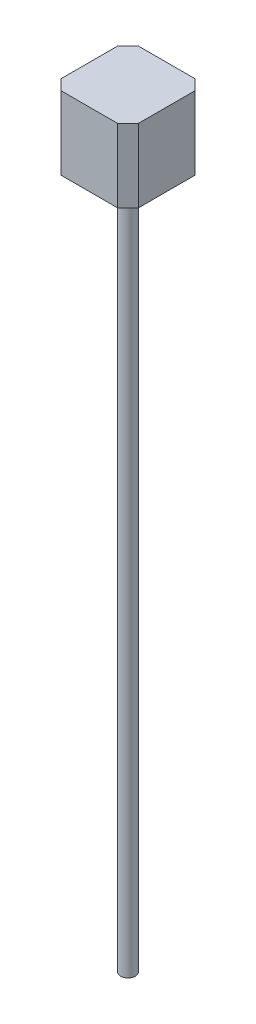
ISO-10303-21;
HEADER;
FILE_DESCRIPTION(('STEP AP214'),'2;1');
FILE_NAME('part.step','',(''),(''),'','','');
FILE_SCHEMA(('AUTOMOTIVE_DESIGN { 1 0 10303 214 1 1 1 1 }'));
ENDSEC;
DATA;
#1=APPLICATION_CONTEXT('core data for automotive mechanical design processes');
#2=APPLICATION_PROTOCOL_DEFINITION('international standard','automotive_design',2000,#1);
#3=PRODUCT_CONTEXT('',#1,'mechanical');
#4=PRODUCT('Part','Part','',(#3));
#5=PRODUCT_RELATED_PRODUCT_CATEGORY('part','',(#4));
#6=PRODUCT_DEFINITION_FORMATION('','',#4);
#7=PRODUCT_DEFINITION_CONTEXT('part definition',#1,'design');
#8=PRODUCT_DEFINITION('design','',#6,#7);
#9=PRODUCT_DEFINITION_SHAPE('','',#8);
#10=(LENGTH_UNIT() NAMED_UNIT(*) SI_UNIT(.MILLI.,.METRE.));
#11=(NAMED_UNIT(*) PLANE_ANGLE_UNIT() SI_UNIT($,.RADIAN.));
#12=(NAMED_UNIT(*) SI_UNIT($,.STERADIAN.) SOLID_ANGLE_UNIT());
#13=UNCERTAINTY_MEASURE_WITH_UNIT(LENGTH_MEASURE(1.E-05),#10,'distance_accuracy_value','');
#14=(GEOMETRIC_REPRESENTATION_CONTEXT(3) GLOBAL_UNCERTAINTY_ASSIGNED_CONTEXT((#13)) GLOBAL_UNIT_ASSIGNED_CONTEXT((#10,
#11,#12)) REPRESENTATION_CONTEXT('',''));
#15=CARTESIAN_POINT('',(0.,0.,0.));
#16=DIRECTION('',(0.,0.,1.));
#17=DIRECTION('',(1.,0.,0.));
#18=AXIS2_PLACEMENT_3D('',#15,#16,#17);
#19=CARTESIAN_POINT('',(21.15,420.,21.15));
#20=DIRECTION('',(-1.,0.,0.));
#21=DIRECTION('',(0.,0.,1.));
#22=AXIS2_PLACEMENT_3D('',#19,#20,#21);
#23=PLANE('',#22);
#24=DIRECTION('',(0.,1.,0.));
#25=VECTOR('',#24,1.);
#26=CARTESIAN_POINT('',(21.15,0.,-15.5));
#27=LINE('',#26,#25);
#28=CARTESIAN_POINT('',(21.15,380.,-15.5));
#29=VERTEX_POINT('',#28);
#30=CARTESIAN_POINT('',(21.15,420.,-15.5));
#31=VERTEX_POINT('',#30);
#32=EDGE_CURVE('E180',#29,#31,#27,.T.);
#33=ORIENTED_EDGE('',*,*,#32,.T.);
#34=DIRECTION('',(0.,0.,-1.));
#35=VECTOR('',#34,1.);
#36=CARTESIAN_POINT('',(21.15,420.,21.15));
#37=LINE('',#36,#35);
#38=CARTESIAN_POINT('',(21.15,420.,15.5));
#39=VERTEX_POINT('',#38);
#40=EDGE_CURVE('E129',#39,#31,#37,.T.);
#41=ORIENTED_EDGE('',*,*,#40,.F.);
#42=DIRECTION('',(0.,1.,0.));
#43=VECTOR('',#42,1.);
#44=CARTESIAN_POINT('',(21.15,0.,15.5));
#45=LINE('',#44,#43);
#46=CARTESIAN_POINT('',(21.15,380.,15.5));
#47=VERTEX_POINT('',#46);
#48=EDGE_CURVE('E168',#47,#39,#45,.T.);
#49=ORIENTED_EDGE('',*,*,#48,.F.);
#50=DIRECTION('',(0.,0.,-1.));
#51=VECTOR('',#50,1.);
#52=CARTESIAN_POINT('',(21.15,380.,21.15));
#53=LINE('',#52,#51);
#54=EDGE_CURVE('E133',#47,#29,#53,.T.);
#55=ORIENTED_EDGE('',*,*,#54,.T.);
#56=EDGE_LOOP('',(#33,#41,#49,#55));
#57=FACE_BOUND('',#56,.T.);
#58=ADVANCED_FACE('F38',(#57),#23,.F.);
#59=CARTESIAN_POINT('',(-21.15,420.,-21.15));
#60=DIRECTION('',(0.,0.,1.));
#61=DIRECTION('',(1.,0.,0.));
#62=AXIS2_PLACEMENT_3D('',#59,#60,#61);
#63=PLANE('',#62);
#64=DIRECTION('',(0.,1.,0.));
#65=VECTOR('',#64,1.);
#66=CARTESIAN_POINT('',(15.5,0.,-21.15));
#67=LINE('',#66,#65);
#68=CARTESIAN_POINT('',(15.5,380.,-21.15));
#69=VERTEX_POINT('',#68);
#70=CARTESIAN_POINT('',(15.5,420.,-21.15));
#71=VERTEX_POINT('',#70);
#72=EDGE_CURVE('E137',#69,#71,#67,.T.);
#73=ORIENTED_EDGE('',*,*,#72,.F.);
#74=DIRECTION('',(-1.,0.,0.));
#75=VECTOR('',#74,1.);
#76=CARTESIAN_POINT('',(-21.15,380.,-21.15));
#77=LINE('',#76,#75);
#78=CARTESIAN_POINT('',(-15.5,380.,-21.15));
#79=VERTEX_POINT('',#78);
#80=EDGE_CURVE('E136',#69,#79,#77,.T.);
#81=ORIENTED_EDGE('',*,*,#80,.T.);
#82=DIRECTION('',(0.,1.,0.));
#83=VECTOR('',#82,1.);
#84=CARTESIAN_POINT('',(-15.5,0.,-21.15));
#85=LINE('',#84,#83);
#86=CARTESIAN_POINT('',(-15.5,420.,-21.15));
#87=VERTEX_POINT('',#86);
#88=EDGE_CURVE('E53',#79,#87,#85,.T.);
#89=ORIENTED_EDGE('',*,*,#88,.T.);
#90=DIRECTION('',(-1.,0.,0.));
#91=VECTOR('',#90,1.);
#92=CARTESIAN_POINT('',(-21.15,420.,-21.15));
#93=LINE('',#92,#91);
#94=EDGE_CURVE('E119',#71,#87,#93,.T.);
#95=ORIENTED_EDGE('',*,*,#94,.F.);
#96=EDGE_LOOP('',(#73,#81,#89,#95));
#97=FACE_BOUND('',#96,.T.);
#98=ADVANCED_FACE('F242',(#97),#63,.F.);
#99=CARTESIAN_POINT('',(-21.15,420.,21.15));
#100=DIRECTION('',(1.,0.,0.));
#101=DIRECTION('',(0.,0.,-1.));
#102=AXIS2_PLACEMENT_3D('',#99,#100,#101);
#103=PLANE('',#102);
#104=DIRECTION('',(0.,1.,0.));
#105=VECTOR('',#104,1.);
#106=CARTESIAN_POINT('',(-21.15,0.,15.5));
#107=LINE('',#106,#105);
#108=CARTESIAN_POINT('',(-21.15,380.,15.5));
#109=VERTEX_POINT('',#108);
#110=CARTESIAN_POINT('',(-21.15,420.,15.5));
#111=VERTEX_POINT('',#110);
#112=EDGE_CURVE('E61',#109,#111,#107,.T.);
#113=ORIENTED_EDGE('',*,*,#112,.T.);
#114=DIRECTION('',(0.,0.,1.));
#115=VECTOR('',#114,1.);
#116=CARTESIAN_POINT('',(-21.15,420.,21.15));
#117=LINE('',#116,#115);
#118=CARTESIAN_POINT('',(-21.15,420.,-15.5));
#119=VERTEX_POINT('',#118);
#120=EDGE_CURVE('E117',#119,#111,#117,.T.);
#121=ORIENTED_EDGE('',*,*,#120,.F.);
#122=DIRECTION('',(0.,1.,0.));
#123=VECTOR('',#122,1.);
#124=CARTESIAN_POINT('',(-21.15,0.,-15.5));
#125=LINE('',#124,#123);
#126=CARTESIAN_POINT('',(-21.15,380.,-15.5));
#127=VERTEX_POINT('',#126);
#128=EDGE_CURVE('E101',#127,#119,#125,.T.);
#129=ORIENTED_EDGE('',*,*,#128,.F.);
#130=DIRECTION('',(0.,0.,1.));
#131=VECTOR('',#130,1.);
#132=CARTESIAN_POINT('',(-21.15,380.,21.15));
#133=LINE('',#132,#131);
#134=EDGE_CURVE('E140',#127,#109,#133,.T.);
#135=ORIENTED_EDGE('',*,*,#134,.T.);
#136=EDGE_LOOP('',(#113,#121,#129,#135));
#137=FACE_BOUND('',#136,.T.);
#138=ADVANCED_FACE('F123',(#137),#103,.F.);
#139=CARTESIAN_POINT('',(-21.15,420.,21.15));
#140=DIRECTION('',(0.,0.,-1.));
#141=DIRECTION('',(-1.,0.,0.));
#142=AXIS2_PLACEMENT_3D('',#139,#140,#141);
#143=PLANE('',#142);
#144=DIRECTION('',(0.,1.,0.));
#145=VECTOR('',#144,1.);
#146=CARTESIAN_POINT('',(15.5,0.,21.15));
#147=LINE('',#146,#145);
#148=CARTESIAN_POINT('',(15.5,380.,21.15));
#149=VERTEX_POINT('',#148);
#150=CARTESIAN_POINT('',(15.5,420.,21.15));
#151=VERTEX_POINT('',#150);
#152=EDGE_CURVE('E165',#149,#151,#147,.T.);
#153=ORIENTED_EDGE('',*,*,#152,.T.);
#154=DIRECTION('',(1.,0.,0.));
#155=VECTOR('',#154,1.);
#156=CARTESIAN_POINT('',(-21.15,420.,21.15));
#157=LINE('',#156,#155);
#158=CARTESIAN_POINT('',(-15.5,420.,21.15));
#159=VERTEX_POINT('',#158);
#160=EDGE_CURVE('E124',#159,#151,#157,.T.);
#161=ORIENTED_EDGE('',*,*,#160,.F.);
#162=DIRECTION('',(0.,1.,0.));
#163=VECTOR('',#162,1.);
#164=CARTESIAN_POINT('',(-15.5,0.,21.15));
#165=LINE('',#164,#163);
#166=CARTESIAN_POINT('',(-15.5,380.,21.15));
#167=VERTEX_POINT('',#166);
#168=EDGE_CURVE('E166',#167,#159,#165,.T.);
#169=ORIENTED_EDGE('',*,*,#168,.F.);
#170=DIRECTION('',(1.,0.,0.));
#171=VECTOR('',#170,1.);
#172=CARTESIAN_POINT('',(-21.15,380.,21.15));
#173=LINE('',#172,#171);
#174=EDGE_CURVE('E142',#167,#149,#173,.T.);
#175=ORIENTED_EDGE('',*,*,#174,.T.);
#176=EDGE_LOOP('',(#153,#161,#169,#175));
#177=FACE_BOUND('',#176,.T.);
#178=ADVANCED_FACE('F163',(#177),#143,.F.);
#179=CARTESIAN_POINT('',(0.,420.,0.));
#180=DIRECTION('',(0.,-1.,0.));
#181=DIRECTION('',(0.,0.,-1.));
#182=AXIS2_PLACEMENT_3D('',#179,#180,#181);
#183=PLANE('',#182);
#184=DIRECTION('',(-0.707106781186546,0.,-0.707106781186549));
#185=VECTOR('',#184,1.);
#186=CARTESIAN_POINT('',(21.15,420.,-15.5));
#187=LINE('',#186,#185);
#188=EDGE_CURVE('E173',#31,#71,#187,.T.);
#189=ORIENTED_EDGE('',*,*,#188,.T.);
#190=ORIENTED_EDGE('',*,*,#94,.T.);
#191=DIRECTION('',(-0.707106781186549,0.,0.707106781186546));
#192=VECTOR('',#191,1.);
#193=CARTESIAN_POINT('',(-15.5,420.,-21.15));
#194=LINE('',#193,#192);
#195=EDGE_CURVE('E104',#87,#119,#194,.T.);
#196=ORIENTED_EDGE('',*,*,#195,.T.);
#197=ORIENTED_EDGE('',*,*,#120,.T.);
#198=DIRECTION('',(0.707106781186546,0.,0.707106781186549));
#199=VECTOR('',#198,1.);
#200=CARTESIAN_POINT('',(-21.15,420.,15.5));
#201=LINE('',#200,#199);
#202=EDGE_CURVE('E120',#111,#159,#201,.T.);
#203=ORIENTED_EDGE('',*,*,#202,.T.);
#204=ORIENTED_EDGE('',*,*,#160,.T.);
#205=DIRECTION('',(0.707106781186549,0.,-0.707106781186546));
#206=VECTOR('',#205,1.);
#207=CARTESIAN_POINT('',(15.5,420.,21.15));
#208=LINE('',#207,#206);
#209=EDGE_CURVE('E177',#151,#39,#208,.T.);
#210=ORIENTED_EDGE('',*,*,#209,.T.);
#211=ORIENTED_EDGE('',*,*,#40,.T.);
#212=EDGE_LOOP('',(#189,#190,#196,#197,#203,#204,#210,#211));
#213=FACE_BOUND('',#212,.T.);
#214=ADVANCED_FACE('F115',(#213),#183,.F.);
#215=CARTESIAN_POINT('',(0.,380.,0.));
#216=DIRECTION('',(0.,-1.,0.));
#217=DIRECTION('',(0.,0.,-1.));
#218=AXIS2_PLACEMENT_3D('',#215,#216,#217);
#219=PLANE('',#218);
#220=CARTESIAN_POINT('',(-15.4999999999991,380.,-15.5));
#221=DIRECTION('',(0.,-1.,0.));
#222=DIRECTION('',(0.,0.,-1.));
#223=AXIS2_PLACEMENT_3D('',#220,#221,#222);
#224=CIRCLE('',#223,1.50000000000047);
#225=CARTESIAN_POINT('',(-15.4999999999991,380.,-17.0000000000005));
#226=VERTEX_POINT('',#225);
#227=EDGE_CURVE('E194',#226,#226,#224,.T.);
#228=ORIENTED_EDGE('',*,*,#227,.F.);
#229=EDGE_LOOP('',(#228));
#230=FACE_BOUND('',#229,.T.);
#231=CARTESIAN_POINT('',(15.5000000000009,380.,-15.4999999999991));
#232=DIRECTION('',(0.,-1.,0.));
#233=DIRECTION('',(0.,0.,-1.));
#234=AXIS2_PLACEMENT_3D('',#231,#232,#233);
#235=CIRCLE('',#234,1.50000000000124);
#236=CARTESIAN_POINT('',(15.5000000000009,380.,-17.0000000000004));
#237=VERTEX_POINT('',#236);
#238=EDGE_CURVE('E200',#237,#237,#235,.T.);
#239=ORIENTED_EDGE('',*,*,#238,.F.);
#240=EDGE_LOOP('',(#239));
#241=FACE_BOUND('',#240,.T.);
#242=CARTESIAN_POINT('',(15.5,380.,15.5000000000009));
#243=DIRECTION('',(0.,-1.,0.));
#244=DIRECTION('',(0.,0.,-1.));
#245=AXIS2_PLACEMENT_3D('',#242,#243,#244);
#246=CIRCLE('',#245,1.50000000000091);
#247=CARTESIAN_POINT('',(15.5,380.,14.));
#248=VERTEX_POINT('',#247);
#249=EDGE_CURVE('E206',#248,#248,#246,.T.);
#250=ORIENTED_EDGE('',*,*,#249,.F.);
#251=EDGE_LOOP('',(#250));
#252=FACE_BOUND('',#251,.T.);
#253=CARTESIAN_POINT('',(-15.5,380.,15.5));
#254=DIRECTION('',(0.,-1.,0.));
#255=DIRECTION('',(0.,0.,-1.));
#256=AXIS2_PLACEMENT_3D('',#253,#254,#255);
#257=CIRCLE('',#256,1.5);
#258=CARTESIAN_POINT('',(-15.5,380.,14.));
#259=VERTEX_POINT('',#258);
#260=EDGE_CURVE('E188',#259,#259,#257,.T.);
#261=ORIENTED_EDGE('',*,*,#260,.F.);
#262=EDGE_LOOP('',(#261));
#263=FACE_BOUND('',#262,.T.);
#264=CARTESIAN_POINT('',(0.,380.,0.));
#265=DIRECTION('',(0.,1.,0.));
#266=DIRECTION('',(0.,0.,1.));
#267=AXIS2_PLACEMENT_3D('',#264,#265,#266);
#268=CIRCLE('',#267,4.);
#269=CARTESIAN_POINT('',(0.,380.,4.));
#270=VERTEX_POINT('',#269);
#271=EDGE_CURVE('E145',#270,#270,#268,.T.);
#272=ORIENTED_EDGE('',*,*,#271,.T.);
#273=EDGE_LOOP('',(#272));
#274=FACE_BOUND('',#273,.T.);
#275=ORIENTED_EDGE('',*,*,#80,.F.);
#276=DIRECTION('',(0.707106781186546,0.,0.707106781186549));
#277=VECTOR('',#276,1.);
#278=CARTESIAN_POINT('',(18.325,380.,-18.325));
#279=LINE('',#278,#277);
#280=EDGE_CURVE('E12',#69,#29,#279,.T.);
#281=ORIENTED_EDGE('',*,*,#280,.T.);
#282=ORIENTED_EDGE('',*,*,#54,.F.);
#283=DIRECTION('',(-0.707106781186549,0.,0.707106781186546));
#284=VECTOR('',#283,1.);
#285=CARTESIAN_POINT('',(18.325,380.,18.325));
#286=LINE('',#285,#284);
#287=EDGE_CURVE('E46',#47,#149,#286,.T.);
#288=ORIENTED_EDGE('',*,*,#287,.T.);
#289=ORIENTED_EDGE('',*,*,#174,.F.);
#290=DIRECTION('',(-0.707106781186546,0.,-0.707106781186549));
#291=VECTOR('',#290,1.);
#292=CARTESIAN_POINT('',(-18.325,380.,18.325));
#293=LINE('',#292,#291);
#294=EDGE_CURVE('E151',#167,#109,#293,.T.);
#295=ORIENTED_EDGE('',*,*,#294,.T.);
#296=ORIENTED_EDGE('',*,*,#134,.F.);
#297=DIRECTION('',(0.707106781186549,0.,-0.707106781186546));
#298=VECTOR('',#297,1.);
#299=CARTESIAN_POINT('',(-18.325,380.,-18.325));
#300=LINE('',#299,#298);
#301=EDGE_CURVE('E105',#127,#79,#300,.T.);
#302=ORIENTED_EDGE('',*,*,#301,.T.);
#303=EDGE_LOOP('',(#275,#281,#282,#288,#289,#295,#296,#302));
#304=FACE_BOUND('',#303,.T.);
#305=ADVANCED_FACE('F157',(#230,#241,#252,#263,#274,#304),#219,.T.);
#306=CARTESIAN_POINT('',(0.,380.,0.));
#307=DIRECTION('',(0.,-1.,0.));
#308=DIRECTION('',(0.,0.,-1.));
#309=AXIS2_PLACEMENT_3D('',#306,#307,#308);
#310=CYLINDRICAL_SURFACE('',#309,4.);
#311=ORIENTED_EDGE('',*,*,#271,.F.);
#312=EDGE_LOOP('',(#311));
#313=FACE_BOUND('',#312,.T.);
#314=CARTESIAN_POINT('',(0.,0.,0.));
#315=DIRECTION('',(0.,1.,0.));
#316=DIRECTION('',(0.,0.,1.));
#317=AXIS2_PLACEMENT_3D('',#314,#315,#316);
#318=CIRCLE('',#317,4.);
#319=CARTESIAN_POINT('',(0.,0.,4.));
#320=VERTEX_POINT('',#319);
#321=EDGE_CURVE('E127',#320,#320,#318,.T.);
#322=ORIENTED_EDGE('',*,*,#321,.T.);
#323=EDGE_LOOP('',(#322));
#324=FACE_BOUND('',#323,.T.);
#325=ADVANCED_FACE('F40',(#313,#324),#310,.T.);
#326=CARTESIAN_POINT('',(0.,0.,0.));
#327=DIRECTION('',(0.,1.,0.));
#328=DIRECTION('',(0.,0.,1.));
#329=AXIS2_PLACEMENT_3D('',#326,#327,#328);
#330=PLANE('',#329);
#331=ORIENTED_EDGE('',*,*,#321,.F.);
#332=EDGE_LOOP('',(#331));
#333=FACE_BOUND('',#332,.T.);
#334=ADVANCED_FACE('F231',(#333),#330,.F.);
#335=CARTESIAN_POINT('',(-15.5,0.,-21.15));
#336=DIRECTION('',(-0.707106781186546,0.,-0.707106781186549));
#337=DIRECTION('',(-0.707106781186549,0.,0.707106781186546));
#338=AXIS2_PLACEMENT_3D('',#335,#336,#337);
#339=PLANE('',#338);
#340=ORIENTED_EDGE('',*,*,#128,.T.);
#341=ORIENTED_EDGE('',*,*,#195,.F.);
#342=ORIENTED_EDGE('',*,*,#88,.F.);
#343=ORIENTED_EDGE('',*,*,#301,.F.);
#344=EDGE_LOOP('',(#340,#341,#342,#343));
#345=FACE_BOUND('',#344,.T.);
#346=ADVANCED_FACE('F103',(#345),#339,.T.);
#347=CARTESIAN_POINT('',(-21.15,0.,15.5));
#348=DIRECTION('',(-0.707106781186549,0.,0.707106781186546));
#349=DIRECTION('',(0.707106781186546,0.,0.707106781186549));
#350=AXIS2_PLACEMENT_3D('',#347,#348,#349);
#351=PLANE('',#350);
#352=ORIENTED_EDGE('',*,*,#168,.T.);
#353=ORIENTED_EDGE('',*,*,#202,.F.);
#354=ORIENTED_EDGE('',*,*,#112,.F.);
#355=ORIENTED_EDGE('',*,*,#294,.F.);
#356=EDGE_LOOP('',(#352,#353,#354,#355));
#357=FACE_BOUND('',#356,.T.);
#358=ADVANCED_FACE('F238',(#357),#351,.T.);
#359=CARTESIAN_POINT('',(15.5,0.,21.15));
#360=DIRECTION('',(0.707106781186546,0.,0.707106781186549));
#361=DIRECTION('',(0.707106781186549,0.,-0.707106781186546));
#362=AXIS2_PLACEMENT_3D('',#359,#360,#361);
#363=PLANE('',#362);
#364=ORIENTED_EDGE('',*,*,#48,.T.);
#365=ORIENTED_EDGE('',*,*,#209,.F.);
#366=ORIENTED_EDGE('',*,*,#152,.F.);
#367=ORIENTED_EDGE('',*,*,#287,.F.);
#368=EDGE_LOOP('',(#364,#365,#366,#367));
#369=FACE_BOUND('',#368,.T.);
#370=ADVANCED_FACE('F257',(#369),#363,.T.);
#371=CARTESIAN_POINT('',(21.15,0.,-15.5));
#372=DIRECTION('',(0.707106781186549,0.,-0.707106781186546));
#373=DIRECTION('',(-0.707106781186546,0.,-0.707106781186549));
#374=AXIS2_PLACEMENT_3D('',#371,#372,#373);
#375=PLANE('',#374);
#376=ORIENTED_EDGE('',*,*,#72,.T.);
#377=ORIENTED_EDGE('',*,*,#188,.F.);
#378=ORIENTED_EDGE('',*,*,#32,.F.);
#379=ORIENTED_EDGE('',*,*,#280,.F.);
#380=EDGE_LOOP('',(#376,#377,#378,#379));
#381=FACE_BOUND('',#380,.T.);
#382=ADVANCED_FACE('F260',(#381),#375,.T.);
#383=CARTESIAN_POINT('',(-15.5,384.,15.5));
#384=DIRECTION('',(0.,-1.,0.));
#385=DIRECTION('',(0.,0.,-1.));
#386=AXIS2_PLACEMENT_3D('',#383,#384,#385);
#387=CYLINDRICAL_SURFACE('',#386,1.5);
#388=CARTESIAN_POINT('',(-15.5,384.,15.5));
#389=DIRECTION('',(0.,-1.,0.));
#390=DIRECTION('',(0.,0.,-1.));
#391=AXIS2_PLACEMENT_3D('',#388,#389,#390);
#392=CIRCLE('',#391,1.5);
#393=CARTESIAN_POINT('',(-15.5,384.,14.));
#394=VERTEX_POINT('',#393);
#395=EDGE_CURVE('E121',#394,#394,#392,.T.);
#396=ORIENTED_EDGE('',*,*,#395,.F.);
#397=EDGE_LOOP('',(#396));
#398=FACE_BOUND('',#397,.T.);
#399=ORIENTED_EDGE('',*,*,#260,.T.);
#400=EDGE_LOOP('',(#399));
#401=FACE_BOUND('',#400,.T.);
#402=ADVANCED_FACE('F263',(#398,#401),#387,.F.);
#403=CARTESIAN_POINT('',(-15.5,384.,15.5));
#404=DIRECTION('',(0.,-1.,0.));
#405=DIRECTION('',(0.,0.,-1.));
#406=AXIS2_PLACEMENT_3D('',#403,#404,#405);
#407=PLANE('',#406);
#408=ORIENTED_EDGE('',*,*,#395,.T.);
#409=EDGE_LOOP('',(#408));
#410=FACE_BOUND('',#409,.T.);
#411=ADVANCED_FACE('F217',(#410),#407,.T.);
#412=CARTESIAN_POINT('',(15.5,384.,15.5000000000009));
#413=DIRECTION('',(0.,-1.,0.));
#414=DIRECTION('',(0.,0.,-1.));
#415=AXIS2_PLACEMENT_3D('',#412,#413,#414);
#416=CYLINDRICAL_SURFACE('',#415,1.50000000000091);
#417=CARTESIAN_POINT('',(15.5,384.,15.5000000000009));
#418=DIRECTION('',(0.,-1.,0.));
#419=DIRECTION('',(0.,0.,-1.));
#420=AXIS2_PLACEMENT_3D('',#417,#418,#419);
#421=CIRCLE('',#420,1.50000000000091);
#422=CARTESIAN_POINT('',(15.5,384.,14.));
#423=VERTEX_POINT('',#422);
#424=EDGE_CURVE('E191',#423,#423,#421,.T.);
#425=ORIENTED_EDGE('',*,*,#424,.F.);
#426=EDGE_LOOP('',(#425));
#427=FACE_BOUND('',#426,.T.);
#428=ORIENTED_EDGE('',*,*,#249,.T.);
#429=EDGE_LOOP('',(#428));
#430=FACE_BOUND('',#429,.T.);
#431=ADVANCED_FACE('F214',(#427,#430),#416,.F.);
#432=CARTESIAN_POINT('',(15.5,384.,15.5000000000009));
#433=DIRECTION('',(0.,-1.,0.));
#434=DIRECTION('',(0.,0.,-1.));
#435=AXIS2_PLACEMENT_3D('',#432,#433,#434);
#436=PLANE('',#435);
#437=ORIENTED_EDGE('',*,*,#424,.T.);
#438=EDGE_LOOP('',(#437));
#439=FACE_BOUND('',#438,.T.);
#440=ADVANCED_FACE('F212',(#439),#436,.T.);
#441=CARTESIAN_POINT('',(15.5000000000009,384.,-15.4999999999991));
#442=DIRECTION('',(0.,-1.,0.));
#443=DIRECTION('',(0.,0.,-1.));
#444=AXIS2_PLACEMENT_3D('',#441,#442,#443);
#445=CYLINDRICAL_SURFACE('',#444,1.50000000000124);
#446=CARTESIAN_POINT('',(15.5000000000009,384.,-15.4999999999991));
#447=DIRECTION('',(0.,-1.,0.));
#448=DIRECTION('',(0.,0.,-1.));
#449=AXIS2_PLACEMENT_3D('',#446,#447,#448);
#450=CIRCLE('',#449,1.50000000000124);
#451=CARTESIAN_POINT('',(15.5000000000009,384.,-17.0000000000004));
#452=VERTEX_POINT('',#451);
#453=EDGE_CURVE('E203',#452,#452,#450,.T.);
#454=ORIENTED_EDGE('',*,*,#453,.F.);
#455=EDGE_LOOP('',(#454));
#456=FACE_BOUND('',#455,.T.);
#457=ORIENTED_EDGE('',*,*,#238,.T.);
#458=EDGE_LOOP('',(#457));
#459=FACE_BOUND('',#458,.T.);
#460=ADVANCED_FACE('F279',(#456,#459),#445,.F.);
#461=CARTESIAN_POINT('',(15.5000000000009,384.,-15.4999999999991));
#462=DIRECTION('',(0.,-1.,0.));
#463=DIRECTION('',(0.,0.,-1.));
#464=AXIS2_PLACEMENT_3D('',#461,#462,#463);
#465=PLANE('',#464);
#466=ORIENTED_EDGE('',*,*,#453,.T.);
#467=EDGE_LOOP('',(#466));
#468=FACE_BOUND('',#467,.T.);
#469=ADVANCED_FACE('F274',(#468),#465,.T.);
#470=CARTESIAN_POINT('',(-15.4999999999991,384.,-15.5));
#471=DIRECTION('',(0.,-1.,0.));
#472=DIRECTION('',(0.,0.,-1.));
#473=AXIS2_PLACEMENT_3D('',#470,#471,#472);
#474=CYLINDRICAL_SURFACE('',#473,1.50000000000047);
#475=CARTESIAN_POINT('',(-15.4999999999991,384.,-15.5));
#476=DIRECTION('',(0.,-1.,0.));
#477=DIRECTION('',(0.,0.,-1.));
#478=AXIS2_PLACEMENT_3D('',#475,#476,#477);
#479=CIRCLE('',#478,1.50000000000047);
#480=CARTESIAN_POINT('',(-15.4999999999991,384.,-17.0000000000005));
#481=VERTEX_POINT('',#480);
#482=EDGE_CURVE('E197',#481,#481,#479,.T.);
#483=ORIENTED_EDGE('',*,*,#482,.F.);
#484=EDGE_LOOP('',(#483));
#485=FACE_BOUND('',#484,.T.);
#486=ORIENTED_EDGE('',*,*,#227,.T.);
#487=EDGE_LOOP('',(#486));
#488=FACE_BOUND('',#487,.T.);
#489=ADVANCED_FACE('F270',(#485,#488),#474,.F.);
#490=CARTESIAN_POINT('',(-15.4999999999991,384.,-15.5));
#491=DIRECTION('',(0.,-1.,0.));
#492=DIRECTION('',(0.,0.,-1.));
#493=AXIS2_PLACEMENT_3D('',#490,#491,#492);
#494=PLANE('',#493);
#495=ORIENTED_EDGE('',*,*,#482,.T.);
#496=EDGE_LOOP('',(#495));
#497=FACE_BOUND('',#496,.T.);
#498=ADVANCED_FACE('F273',(#497),#494,.T.);
#499=CLOSED_SHELL('',(#58,#98,#138,#178,#214,#305,#325,#334,#346,#358,#370,#382,#402,#411,#431,
#440,#460,#469,#489,#498));
#500=MANIFOLD_SOLID_BREP('B2',#499);
#501=ADVANCED_BREP_SHAPE_REPRESENTATION('',(#18,#500),#14);
#502=SHAPE_DEFINITION_REPRESENTATION(#9,#501);
ENDSEC;
END-ISO-10303-21;
